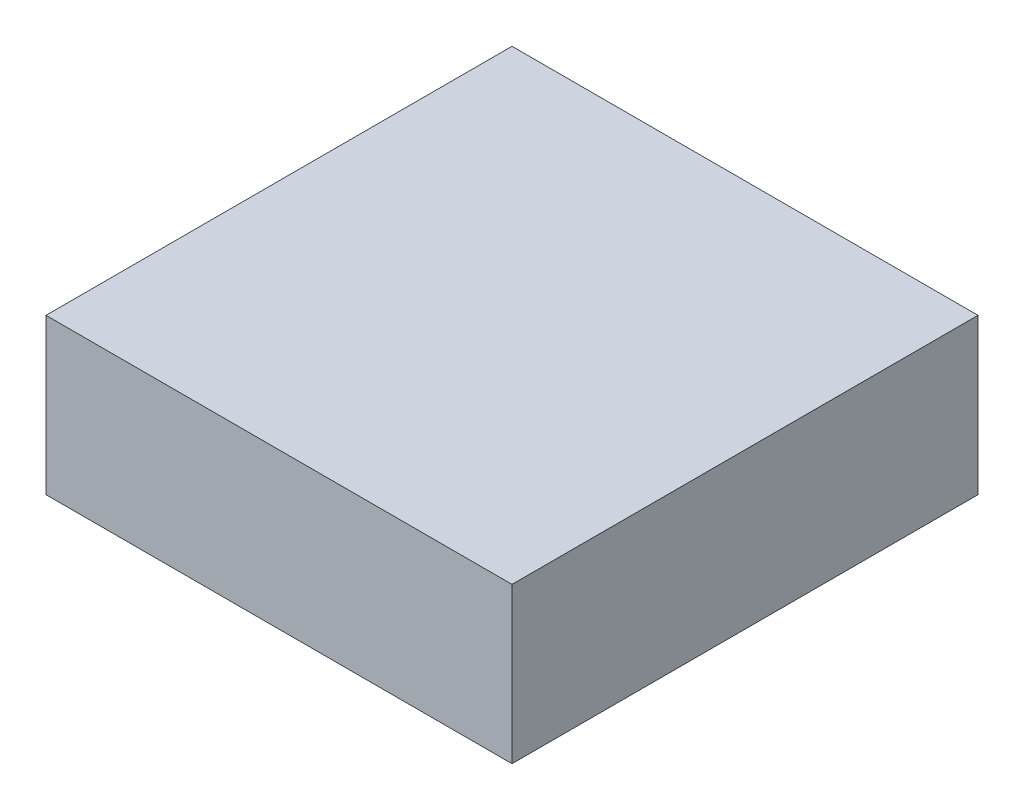
ISO-10303-21;
HEADER;
FILE_DESCRIPTION(('STEP AP214'),'2;1');
FILE_NAME('part.step','',(''),(''),'','','');
FILE_SCHEMA(('AUTOMOTIVE_DESIGN { 1 0 10303 214 1 1 1 1 }'));
ENDSEC;
DATA;
#1=APPLICATION_CONTEXT('core data for automotive mechanical design processes');
#2=APPLICATION_PROTOCOL_DEFINITION('international standard','automotive_design',2000,#1);
#3=PRODUCT_CONTEXT('',#1,'mechanical');
#4=PRODUCT('Part','Part','',(#3));
#5=PRODUCT_RELATED_PRODUCT_CATEGORY('part','',(#4));
#6=PRODUCT_DEFINITION_FORMATION('','',#4);
#7=PRODUCT_DEFINITION_CONTEXT('part definition',#1,'design');
#8=PRODUCT_DEFINITION('design','',#6,#7);
#9=PRODUCT_DEFINITION_SHAPE('','',#8);
#10=(LENGTH_UNIT() NAMED_UNIT(*) SI_UNIT(.MILLI.,.METRE.));
#11=(NAMED_UNIT(*) PLANE_ANGLE_UNIT() SI_UNIT($,.RADIAN.));
#12=(NAMED_UNIT(*) SI_UNIT($,.STERADIAN.) SOLID_ANGLE_UNIT());
#13=UNCERTAINTY_MEASURE_WITH_UNIT(LENGTH_MEASURE(1.E-05),#10,'distance_accuracy_value','');
#14=(GEOMETRIC_REPRESENTATION_CONTEXT(3) GLOBAL_UNCERTAINTY_ASSIGNED_CONTEXT((#13)) GLOBAL_UNIT_ASSIGNED_CONTEXT((#10,
#11,#12)) REPRESENTATION_CONTEXT('',''));
#15=CARTESIAN_POINT('',(0.,0.,0.));
#16=DIRECTION('',(0.,0.,1.));
#17=DIRECTION('',(1.,0.,0.));
#18=AXIS2_PLACEMENT_3D('',#15,#16,#17);
#19=CARTESIAN_POINT('',(-15.,10.,-15.));
#20=DIRECTION('',(1.,0.,0.));
#21=DIRECTION('',(0.,0.,-1.));
#22=AXIS2_PLACEMENT_3D('',#19,#20,#21);
#23=PLANE('',#22);
#24=DIRECTION('',(0.,0.,1.));
#25=VECTOR('',#24,1.);
#26=CARTESIAN_POINT('',(-15.,0.,-15.));
#27=LINE('',#26,#25);
#28=CARTESIAN_POINT('',(-15.,0.,-15.));
#29=VERTEX_POINT('',#28);
#30=CARTESIAN_POINT('',(-15.,0.,15.));
#31=VERTEX_POINT('',#30);
#32=EDGE_CURVE('E107',#29,#31,#27,.T.);
#33=ORIENTED_EDGE('',*,*,#32,.T.);
#34=DIRECTION('',(0.,-1.,0.));
#35=VECTOR('',#34,1.);
#36=CARTESIAN_POINT('',(-15.,10.,15.));
#37=LINE('',#36,#35);
#38=CARTESIAN_POINT('',(-15.,10.,15.));
#39=VERTEX_POINT('',#38);
#40=EDGE_CURVE('E11',#39,#31,#37,.T.);
#41=ORIENTED_EDGE('',*,*,#40,.F.);
#42=DIRECTION('',(0.,0.,1.));
#43=VECTOR('',#42,1.);
#44=CARTESIAN_POINT('',(-15.,10.,-15.));
#45=LINE('',#44,#43);
#46=CARTESIAN_POINT('',(-15.,10.,-15.));
#47=VERTEX_POINT('',#46);
#48=EDGE_CURVE('E91',#47,#39,#45,.T.);
#49=ORIENTED_EDGE('',*,*,#48,.F.);
#50=DIRECTION('',(0.,-1.,0.));
#51=VECTOR('',#50,1.);
#52=CARTESIAN_POINT('',(-15.,10.,-15.));
#53=LINE('',#52,#51);
#54=EDGE_CURVE('E103',#47,#29,#53,.T.);
#55=ORIENTED_EDGE('',*,*,#54,.T.);
#56=EDGE_LOOP('',(#33,#41,#49,#55));
#57=FACE_BOUND('',#56,.T.);
#58=ADVANCED_FACE('F39',(#57),#23,.F.);
#59=CARTESIAN_POINT('',(15.,10.,15.));
#60=DIRECTION('',(0.,0.,-1.));
#61=DIRECTION('',(-1.,0.,0.));
#62=AXIS2_PLACEMENT_3D('',#59,#60,#61);
#63=PLANE('',#62);
#64=DIRECTION('',(1.,0.,0.));
#65=VECTOR('',#64,1.);
#66=CARTESIAN_POINT('',(15.,0.,15.));
#67=LINE('',#66,#65);
#68=CARTESIAN_POINT('',(15.,0.,15.));
#69=VERTEX_POINT('',#68);
#70=EDGE_CURVE('E96',#31,#69,#67,.T.);
#71=ORIENTED_EDGE('',*,*,#70,.T.);
#72=DIRECTION('',(0.,-1.,0.));
#73=VECTOR('',#72,1.);
#74=CARTESIAN_POINT('',(15.,10.,15.));
#75=LINE('',#74,#73);
#76=CARTESIAN_POINT('',(15.,10.,15.));
#77=VERTEX_POINT('',#76);
#78=EDGE_CURVE('E48',#77,#69,#75,.T.);
#79=ORIENTED_EDGE('',*,*,#78,.F.);
#80=DIRECTION('',(1.,0.,0.));
#81=VECTOR('',#80,1.);
#82=CARTESIAN_POINT('',(15.,10.,15.));
#83=LINE('',#82,#81);
#84=EDGE_CURVE('E86',#39,#77,#83,.T.);
#85=ORIENTED_EDGE('',*,*,#84,.F.);
#86=ORIENTED_EDGE('',*,*,#40,.T.);
#87=EDGE_LOOP('',(#71,#79,#85,#86));
#88=FACE_BOUND('',#87,.T.);
#89=ADVANCED_FACE('F95',(#88),#63,.F.);
#90=CARTESIAN_POINT('',(15.,10.,-15.));
#91=DIRECTION('',(-1.,0.,0.));
#92=DIRECTION('',(0.,0.,1.));
#93=AXIS2_PLACEMENT_3D('',#90,#91,#92);
#94=PLANE('',#93);
#95=DIRECTION('',(0.,0.,-1.));
#96=VECTOR('',#95,1.);
#97=CARTESIAN_POINT('',(15.,0.,-15.));
#98=LINE('',#97,#96);
#99=CARTESIAN_POINT('',(15.,0.,-15.));
#100=VERTEX_POINT('',#99);
#101=EDGE_CURVE('E73',#69,#100,#98,.T.);
#102=ORIENTED_EDGE('',*,*,#101,.T.);
#103=DIRECTION('',(0.,-1.,0.));
#104=VECTOR('',#103,1.);
#105=CARTESIAN_POINT('',(15.,10.,-15.));
#106=LINE('',#105,#104);
#107=CARTESIAN_POINT('',(15.,10.,-15.));
#108=VERTEX_POINT('',#107);
#109=EDGE_CURVE('E98',#108,#100,#106,.T.);
#110=ORIENTED_EDGE('',*,*,#109,.F.);
#111=DIRECTION('',(0.,0.,-1.));
#112=VECTOR('',#111,1.);
#113=CARTESIAN_POINT('',(15.,10.,-15.));
#114=LINE('',#113,#112);
#115=EDGE_CURVE('E89',#77,#108,#114,.T.);
#116=ORIENTED_EDGE('',*,*,#115,.F.);
#117=ORIENTED_EDGE('',*,*,#78,.T.);
#118=EDGE_LOOP('',(#102,#110,#116,#117));
#119=FACE_BOUND('',#118,.T.);
#120=ADVANCED_FACE('F99',(#119),#94,.F.);
#121=CARTESIAN_POINT('',(15.,10.,-15.));
#122=DIRECTION('',(0.,0.,1.));
#123=DIRECTION('',(1.,0.,0.));
#124=AXIS2_PLACEMENT_3D('',#121,#122,#123);
#125=PLANE('',#124);
#126=DIRECTION('',(-1.,0.,0.));
#127=VECTOR('',#126,1.);
#128=CARTESIAN_POINT('',(15.,0.,-15.));
#129=LINE('',#128,#127);
#130=EDGE_CURVE('E79',#100,#29,#129,.T.);
#131=ORIENTED_EDGE('',*,*,#130,.T.);
#132=ORIENTED_EDGE('',*,*,#54,.F.);
#133=DIRECTION('',(-1.,0.,0.));
#134=VECTOR('',#133,1.);
#135=CARTESIAN_POINT('',(15.,10.,-15.));
#136=LINE('',#135,#134);
#137=EDGE_CURVE('E56',#108,#47,#136,.T.);
#138=ORIENTED_EDGE('',*,*,#137,.F.);
#139=ORIENTED_EDGE('',*,*,#109,.T.);
#140=EDGE_LOOP('',(#131,#132,#138,#139));
#141=FACE_BOUND('',#140,.T.);
#142=ADVANCED_FACE('F120',(#141),#125,.F.);
#143=CARTESIAN_POINT('',(0.,10.,0.));
#144=DIRECTION('',(0.,-1.,0.));
#145=DIRECTION('',(0.,0.,-1.));
#146=AXIS2_PLACEMENT_3D('',#143,#144,#145);
#147=PLANE('',#146);
#148=ORIENTED_EDGE('',*,*,#48,.T.);
#149=ORIENTED_EDGE('',*,*,#84,.T.);
#150=ORIENTED_EDGE('',*,*,#115,.T.);
#151=ORIENTED_EDGE('',*,*,#137,.T.);
#152=EDGE_LOOP('',(#148,#149,#150,#151));
#153=FACE_BOUND('',#152,.T.);
#154=ADVANCED_FACE('F87',(#153),#147,.F.);
#155=CARTESIAN_POINT('',(0.,0.,0.));
#156=DIRECTION('',(0.,-1.,0.));
#157=DIRECTION('',(0.,0.,-1.));
#158=AXIS2_PLACEMENT_3D('',#155,#156,#157);
#159=PLANE('',#158);
#160=ORIENTED_EDGE('',*,*,#32,.F.);
#161=ORIENTED_EDGE('',*,*,#130,.F.);
#162=ORIENTED_EDGE('',*,*,#101,.F.);
#163=ORIENTED_EDGE('',*,*,#70,.F.);
#164=EDGE_LOOP('',(#160,#161,#162,#163));
#165=FACE_BOUND('',#164,.T.);
#166=ADVANCED_FACE('F123',(#165),#159,.T.);
#167=CLOSED_SHELL('',(#58,#89,#120,#142,#154,#166));
#168=MANIFOLD_SOLID_BREP('B2',#167);
#169=ADVANCED_BREP_SHAPE_REPRESENTATION('',(#18,#168),#14);
#170=SHAPE_DEFINITION_REPRESENTATION(#9,#169);
ENDSEC;
END-ISO-10303-21;
